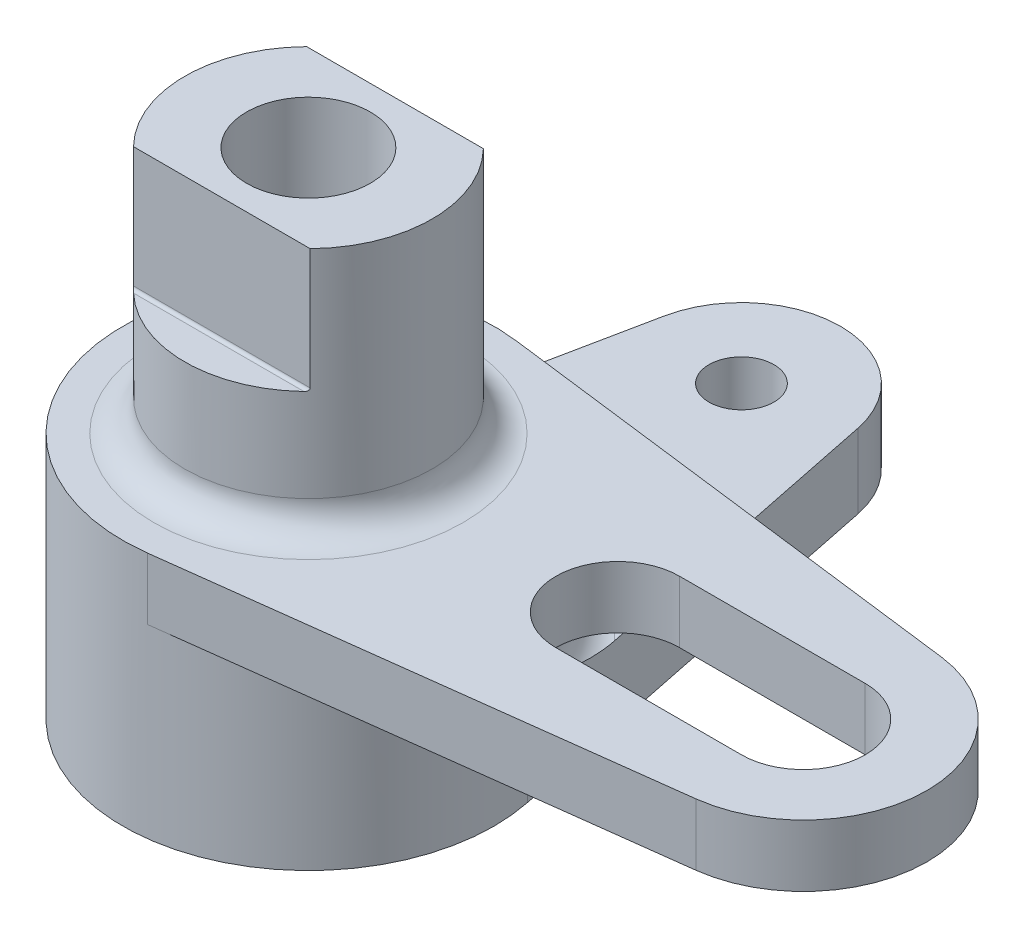
ISO-10303-21;
HEADER;
FILE_DESCRIPTION(('STEP AP214'),'2;1');
FILE_NAME('part.step','',(''),(''),'','','');
FILE_SCHEMA(('AUTOMOTIVE_DESIGN { 1 0 10303 214 1 1 1 1 }'));
ENDSEC;
DATA;
#1=APPLICATION_CONTEXT('core data for automotive mechanical design processes');
#2=APPLICATION_PROTOCOL_DEFINITION('international standard','automotive_design',2000,#1);
#3=PRODUCT_CONTEXT('',#1,'mechanical');
#4=PRODUCT('Part','Part','',(#3));
#5=PRODUCT_RELATED_PRODUCT_CATEGORY('part','',(#4));
#6=PRODUCT_DEFINITION_FORMATION('','',#4);
#7=PRODUCT_DEFINITION_CONTEXT('part definition',#1,'design');
#8=PRODUCT_DEFINITION('design','',#6,#7);
#9=PRODUCT_DEFINITION_SHAPE('','',#8);
#10=(LENGTH_UNIT() NAMED_UNIT(*) SI_UNIT(.MILLI.,.METRE.));
#11=(NAMED_UNIT(*) PLANE_ANGLE_UNIT() SI_UNIT($,.RADIAN.));
#12=(NAMED_UNIT(*) SI_UNIT($,.STERADIAN.) SOLID_ANGLE_UNIT());
#13=UNCERTAINTY_MEASURE_WITH_UNIT(LENGTH_MEASURE(1.E-05),#10,'distance_accuracy_value','');
#14=(GEOMETRIC_REPRESENTATION_CONTEXT(3) GLOBAL_UNCERTAINTY_ASSIGNED_CONTEXT((#13)) GLOBAL_UNIT_ASSIGNED_CONTEXT((#10,
#11,#12)) REPRESENTATION_CONTEXT('',''));
#15=CARTESIAN_POINT('',(0.,0.,0.));
#16=DIRECTION('',(0.,0.,1.));
#17=DIRECTION('',(1.,0.,0.));
#18=AXIS2_PLACEMENT_3D('',#15,#16,#17);
#19=CARTESIAN_POINT('',(0.,40.,0.));
#20=DIRECTION('',(0.,-1.,0.));
#21=DIRECTION('',(0.,0.,-1.));
#22=AXIS2_PLACEMENT_3D('',#19,#20,#21);
#23=CYLINDRICAL_SURFACE('',#22,30.);
#24=CARTESIAN_POINT('',(0.,17.,0.));
#25=DIRECTION('',(0.,1.,0.));
#26=DIRECTION('',(0.,0.,1.));
#27=AXIS2_PLACEMENT_3D('',#24,#25,#26);
#28=CIRCLE('',#27,30.);
#29=CARTESIAN_POINT('',(29.3938769133981,17.,-6.));
#30=VERTEX_POINT('',#29);
#31=CARTESIAN_POINT('',(-29.3938769133981,17.,-6.));
#32=VERTEX_POINT('',#31);
#33=EDGE_CURVE('E326',#30,#32,#28,.T.);
#34=ORIENTED_EDGE('',*,*,#33,.T.);
#35=DIRECTION('',(0.,-1.,0.));
#36=VECTOR('',#35,1.);
#37=CARTESIAN_POINT('',(-29.3938769133981,12.,-6.));
#38=LINE('',#37,#36);
#39=CARTESIAN_POINT('',(-29.3938769133981,0.,-6.));
#40=VERTEX_POINT('',#39);
#41=EDGE_CURVE('E276',#32,#40,#38,.T.);
#42=ORIENTED_EDGE('',*,*,#41,.T.);
#43=CARTESIAN_POINT('',(0.,0.,0.));
#44=DIRECTION('',(0.,1.,0.));
#45=DIRECTION('',(0.,0.,1.));
#46=AXIS2_PLACEMENT_3D('',#43,#44,#45);
#47=CIRCLE('',#46,30.);
#48=CARTESIAN_POINT('',(29.3938769133981,0.,-6.));
#49=VERTEX_POINT('',#48);
#50=EDGE_CURVE('E315',#40,#49,#47,.T.);
#51=ORIENTED_EDGE('',*,*,#50,.T.);
#52=DIRECTION('',(0.,-1.,0.));
#53=VECTOR('',#52,1.);
#54=CARTESIAN_POINT('',(29.3938769133981,12.,-6.));
#55=LINE('',#54,#53);
#56=EDGE_CURVE('E267',#30,#49,#55,.T.);
#57=ORIENTED_EDGE('',*,*,#56,.F.);
#58=EDGE_LOOP('',(#34,#42,#51,#57));
#59=FACE_BOUND('',#58,.T.);
#60=DIRECTION('',(0.,1.,0.));
#61=VECTOR('',#60,1.);
#62=CARTESIAN_POINT('',(3.75,30.,29.7647022494767));
#63=LINE('',#62,#61);
#64=CARTESIAN_POINT('',(3.75,30.,29.7647022494767));
#65=VERTEX_POINT('',#64);
#66=CARTESIAN_POINT('',(3.75,40.,29.7647022494767));
#67=VERTEX_POINT('',#66);
#68=EDGE_CURVE('E244',#65,#67,#63,.T.);
#69=ORIENTED_EDGE('',*,*,#68,.T.);
#70=CARTESIAN_POINT('',(0.,40.,0.));
#71=DIRECTION('',(0.,1.,0.));
#72=DIRECTION('',(0.,0.,1.));
#73=AXIS2_PLACEMENT_3D('',#70,#71,#72);
#74=CIRCLE('',#73,30.);
#75=CARTESIAN_POINT('',(3.75,40.,-29.7647022494766));
#76=VERTEX_POINT('',#75);
#77=EDGE_CURVE('E316',#76,#67,#74,.T.);
#78=ORIENTED_EDGE('',*,*,#77,.F.);
#79=DIRECTION('',(0.,1.,0.));
#80=VECTOR('',#79,1.);
#81=CARTESIAN_POINT('',(3.75,30.,-29.7647022494767));
#82=LINE('',#81,#80);
#83=CARTESIAN_POINT('',(3.75,30.,-29.7647022494767));
#84=VERTEX_POINT('',#83);
#85=EDGE_CURVE('E248',#84,#76,#82,.T.);
#86=ORIENTED_EDGE('',*,*,#85,.F.);
#87=CARTESIAN_POINT('',(0.,30.,0.));
#88=DIRECTION('',(0.,1.,0.));
#89=DIRECTION('',(0.,0.,1.));
#90=AXIS2_PLACEMENT_3D('',#87,#88,#89);
#91=CIRCLE('',#90,30.);
#92=EDGE_CURVE('E204',#65,#84,#91,.T.);
#93=ORIENTED_EDGE('',*,*,#92,.F.);
#94=EDGE_LOOP('',(#69,#78,#86,#93));
#95=FACE_BOUND('',#94,.T.);
#96=ADVANCED_FACE('F47',(#59,#95),#23,.T.);
#97=CARTESIAN_POINT('',(0.,40.,0.));
#98=DIRECTION('',(0.,1.,0.));
#99=DIRECTION('',(0.,0.,1.));
#100=AXIS2_PLACEMENT_3D('',#97,#98,#99);
#101=PLANE('',#100);
#102=CARTESIAN_POINT('',(0.,40.,0.));
#103=DIRECTION('',(0.,1.,0.));
#104=DIRECTION('',(0.,0.,1.));
#105=AXIS2_PLACEMENT_3D('',#102,#103,#104);
#106=CIRCLE('',#105,25.);
#107=CARTESIAN_POINT('',(0.,40.,25.));
#108=VERTEX_POINT('',#107);
#109=EDGE_CURVE('E323',#108,#108,#106,.F.);
#110=ORIENTED_EDGE('',*,*,#109,.T.);
#111=EDGE_LOOP('',(#110));
#112=FACE_BOUND('',#111,.T.);
#113=ORIENTED_EDGE('',*,*,#77,.T.);
#114=DIRECTION('',(0.992156741649222,0.,-0.125));
#115=VECTOR('',#114,1.);
#116=CARTESIAN_POINT('',(3.75,40.,29.7647022494766));
#117=LINE('',#116,#115);
#118=CARTESIAN_POINT('',(82.5,40.,19.8431348329844));
#119=VERTEX_POINT('',#118);
#120=EDGE_CURVE('E239',#67,#119,#117,.T.);
#121=ORIENTED_EDGE('',*,*,#120,.T.);
#122=CARTESIAN_POINT('',(80.,40.,0.));
#123=DIRECTION('',(0.,1.,0.));
#124=DIRECTION('',(0.,0.,1.));
#125=AXIS2_PLACEMENT_3D('',#122,#123,#124);
#126=CIRCLE('',#125,20.);
#127=CARTESIAN_POINT('',(82.5,40.,-19.8431348329844));
#128=VERTEX_POINT('',#127);
#129=EDGE_CURVE('E212',#119,#128,#126,.T.);
#130=ORIENTED_EDGE('',*,*,#129,.T.);
#131=DIRECTION('',(0.992156741649222,0.,0.125));
#132=VECTOR('',#131,1.);
#133=CARTESIAN_POINT('',(3.75,40.,-29.7647022494766));
#134=LINE('',#133,#132);
#135=EDGE_CURVE('E209',#76,#128,#134,.T.);
#136=ORIENTED_EDGE('',*,*,#135,.F.);
#137=EDGE_LOOP('',(#113,#121,#130,#136));
#138=FACE_BOUND('',#137,.T.);
#139=CARTESIAN_POINT('',(80.,40.,0.));
#140=DIRECTION('',(0.,1.,0.));
#141=DIRECTION('',(0.,0.,1.));
#142=AXIS2_PLACEMENT_3D('',#139,#140,#141);
#143=CIRCLE('',#142,10.);
#144=CARTESIAN_POINT('',(80.,40.,10.));
#145=VERTEX_POINT('',#144);
#146=CARTESIAN_POINT('',(80.,40.,-10.));
#147=VERTEX_POINT('',#146);
#148=EDGE_CURVE('E231',#145,#147,#143,.T.);
#149=ORIENTED_EDGE('',*,*,#148,.F.);
#150=DIRECTION('',(1.,0.,0.));
#151=VECTOR('',#150,1.);
#152=CARTESIAN_POINT('',(0.,40.,10.));
#153=LINE('',#152,#151);
#154=CARTESIAN_POINT('',(50.,40.,10.));
#155=VERTEX_POINT('',#154);
#156=EDGE_CURVE('E199',#155,#145,#153,.T.);
#157=ORIENTED_EDGE('',*,*,#156,.F.);
#158=CARTESIAN_POINT('',(50.,40.,0.));
#159=DIRECTION('',(0.,1.,0.));
#160=DIRECTION('',(0.,0.,1.));
#161=AXIS2_PLACEMENT_3D('',#158,#159,#160);
#162=CIRCLE('',#161,10.);
#163=CARTESIAN_POINT('',(50.,40.,-10.));
#164=VERTEX_POINT('',#163);
#165=EDGE_CURVE('E234',#164,#155,#162,.T.);
#166=ORIENTED_EDGE('',*,*,#165,.F.);
#167=DIRECTION('',(1.,0.,0.));
#168=VECTOR('',#167,1.);
#169=CARTESIAN_POINT('',(0.,40.,-10.));
#170=LINE('',#169,#168);
#171=EDGE_CURVE('E236',#164,#147,#170,.T.);
#172=ORIENTED_EDGE('',*,*,#171,.T.);
#173=EDGE_LOOP('',(#149,#157,#166,#172));
#174=FACE_BOUND('',#173,.T.);
#175=ADVANCED_FACE('F445',(#112,#138,#174),#101,.T.);
#176=CARTESIAN_POINT('',(0.,0.,0.));
#177=DIRECTION('',(0.,1.,0.));
#178=DIRECTION('',(0.,0.,1.));
#179=AXIS2_PLACEMENT_3D('',#176,#177,#178);
#180=PLANE('',#179);
#181=CARTESIAN_POINT('',(0.,0.,-70.));
#182=DIRECTION('',(0.,1.,0.));
#183=DIRECTION('',(0.,0.,1.));
#184=AXIS2_PLACEMENT_3D('',#181,#182,#183);
#185=CIRCLE('',#184,5.25);
#186=CARTESIAN_POINT('',(0.,0.,-64.75));
#187=VERTEX_POINT('',#186);
#188=EDGE_CURVE('E215',#187,#187,#185,.T.);
#189=ORIENTED_EDGE('',*,*,#188,.T.);
#190=EDGE_LOOP('',(#189));
#191=FACE_BOUND('',#190,.T.);
#192=ORIENTED_EDGE('',*,*,#50,.F.);
#193=DIRECTION('',(-0.2,0.,0.979795897113271));
#194=VECTOR('',#193,1.);
#195=CARTESIAN_POINT('',(-29.3938769133981,0.,-6.));
#196=LINE('',#195,#194);
#197=CARTESIAN_POINT('',(-15.6767343538123,0.,-73.2));
#198=VERTEX_POINT('',#197);
#199=EDGE_CURVE('E262',#198,#40,#196,.T.);
#200=ORIENTED_EDGE('',*,*,#199,.F.);
#201=CARTESIAN_POINT('',(0.,0.,-70.));
#202=DIRECTION('',(0.,1.,0.));
#203=DIRECTION('',(0.,0.,1.));
#204=AXIS2_PLACEMENT_3D('',#201,#202,#203);
#205=CIRCLE('',#204,16.);
#206=CARTESIAN_POINT('',(15.6767343538123,0.,-73.2));
#207=VERTEX_POINT('',#206);
#208=EDGE_CURVE('E270',#207,#198,#205,.T.);
#209=ORIENTED_EDGE('',*,*,#208,.F.);
#210=DIRECTION('',(0.2,0.,0.979795897113271));
#211=VECTOR('',#210,1.);
#212=CARTESIAN_POINT('',(29.3938769133981,0.,-6.00000000000001));
#213=LINE('',#212,#211);
#214=EDGE_CURVE('E247',#207,#49,#213,.T.);
#215=ORIENTED_EDGE('',*,*,#214,.T.);
#216=EDGE_LOOP('',(#192,#200,#209,#215));
#217=FACE_BOUND('',#216,.T.);
#218=CARTESIAN_POINT('',(0.,0.,0.));
#219=DIRECTION('',(0.,1.,0.));
#220=DIRECTION('',(0.,0.,1.));
#221=AXIS2_PLACEMENT_3D('',#218,#219,#220);
#222=CIRCLE('',#221,10.);
#223=CARTESIAN_POINT('',(0.,0.,10.));
#224=VERTEX_POINT('',#223);
#225=EDGE_CURVE('E289',#224,#224,#222,.T.);
#226=ORIENTED_EDGE('',*,*,#225,.T.);
#227=EDGE_LOOP('',(#226));
#228=FACE_BOUND('',#227,.T.);
#229=ADVANCED_FACE('F427',(#191,#217,#228),#180,.F.);
#230=CARTESIAN_POINT('',(0.,80.,14.));
#231=DIRECTION('',(0.,0.,-1.));
#232=DIRECTION('',(-1.,0.,0.));
#233=AXIS2_PLACEMENT_3D('',#230,#231,#232);
#234=PLANE('',#233);
#235=DIRECTION('',(0.,-1.,0.));
#236=VECTOR('',#235,1.);
#237=CARTESIAN_POINT('',(-14.2828568570857,80.,14.));
#238=LINE('',#237,#236);
#239=CARTESIAN_POINT('',(-14.2828568570857,80.,14.));
#240=VERTEX_POINT('',#239);
#241=CARTESIAN_POINT('',(-14.2828568570857,60.5,14.));
#242=VERTEX_POINT('',#241);
#243=EDGE_CURVE('E304',#240,#242,#238,.T.);
#244=ORIENTED_EDGE('',*,*,#243,.T.);
#245=DIRECTION('',(1.,0.,0.));
#246=VECTOR('',#245,1.);
#247=CARTESIAN_POINT('',(0.,60.5,14.));
#248=LINE('',#247,#246);
#249=CARTESIAN_POINT('',(14.2828568570857,60.5,14.));
#250=VERTEX_POINT('',#249);
#251=EDGE_CURVE('E407',#242,#250,#248,.T.);
#252=ORIENTED_EDGE('',*,*,#251,.T.);
#253=DIRECTION('',(0.,-1.,0.));
#254=VECTOR('',#253,1.);
#255=CARTESIAN_POINT('',(14.2828568570857,80.,14.));
#256=LINE('',#255,#254);
#257=CARTESIAN_POINT('',(14.2828568570857,80.,14.));
#258=VERTEX_POINT('',#257);
#259=EDGE_CURVE('E313',#258,#250,#256,.T.);
#260=ORIENTED_EDGE('',*,*,#259,.F.);
#261=DIRECTION('',(1.,0.,0.));
#262=VECTOR('',#261,1.);
#263=CARTESIAN_POINT('',(0.,80.,14.));
#264=LINE('',#263,#262);
#265=EDGE_CURVE('E293',#240,#258,#264,.T.);
#266=ORIENTED_EDGE('',*,*,#265,.F.);
#267=EDGE_LOOP('',(#244,#252,#260,#266));
#268=FACE_BOUND('',#267,.T.);
#269=ADVANCED_FACE('F381',(#268),#234,.F.);
#270=CARTESIAN_POINT('',(0.,80.,0.));
#271=DIRECTION('',(0.,-1.,0.));
#272=DIRECTION('',(0.,0.,-1.));
#273=AXIS2_PLACEMENT_3D('',#270,#271,#272);
#274=CYLINDRICAL_SURFACE('',#273,20.);
#275=CARTESIAN_POINT('',(0.,45.,0.));
#276=DIRECTION('',(0.,1.,0.));
#277=DIRECTION('',(0.,0.,1.));
#278=AXIS2_PLACEMENT_3D('',#275,#276,#277);
#279=CIRCLE('',#278,20.);
#280=CARTESIAN_POINT('',(0.,45.,20.));
#281=VERTEX_POINT('',#280);
#282=EDGE_CURVE('E319',#281,#281,#279,.T.);
#283=ORIENTED_EDGE('',*,*,#282,.T.);
#284=EDGE_LOOP('',(#283));
#285=FACE_BOUND('',#284,.T.);
#286=ORIENTED_EDGE('',*,*,#259,.T.);
#287=CARTESIAN_POINT('',(14.2828568570857,60.5,14.));
#288=CARTESIAN_POINT('',(14.282892211907,60.477494661395,13.9999622719365));
#289=CARTESIAN_POINT('',(14.2813701041783,60.4550427668654,14.0015168375368));
#290=CARTESIAN_POINT('',(14.2755173597065,60.4110817284993,14.0074848994275));
#291=CARTESIAN_POINT('',(14.2712100442842,60.3895663255434,14.0118746555228));
#292=CARTESIAN_POINT('',(14.2600985504329,60.3479735871636,14.0231825032615));
#293=CARTESIAN_POINT('',(14.2533007508946,60.3278927330725,14.0300941354273));
#294=CARTESIAN_POINT('',(14.2376040838453,60.28943237724,14.0460227920367));
#295=CARTESIAN_POINT('',(14.2287007265671,60.27105662959,14.0550443150259));
#296=CARTESIAN_POINT('',(14.2053738472395,60.229408634353,14.0786264465018));
#297=CARTESIAN_POINT('',(14.1901527945546,60.2070291832468,14.0939739336551));
#298=CARTESIAN_POINT('',(14.1573230076271,60.1660399055829,14.1269512045527));
#299=CARTESIAN_POINT('',(14.1397103225539,60.1474364463404,14.144584762517));
#300=CARTESIAN_POINT('',(14.0956199389038,60.107327308579,14.1885446525953));
#301=CARTESIAN_POINT('',(14.0683506116487,60.0874878196058,14.2155927794266));
#302=CARTESIAN_POINT('',(14.0117310277543,60.0541251796631,14.2714045210313));
#303=CARTESIAN_POINT('',(13.9823754305029,60.0406189648458,14.3001725062299));
#304=CARTESIAN_POINT('',(13.9235102048875,60.0198038427119,14.3574887665468));
#305=CARTESIAN_POINT('',(13.8940429847191,60.0122920816588,14.3860086315521));
#306=CARTESIAN_POINT('',(13.8347258889886,60.002424350045,14.4430630901981));
#307=CARTESIAN_POINT('',(13.8048810471959,60.0000271050636,14.4715956928404));
#308=CARTESIAN_POINT('',(13.7749773139559,60.,14.5));
#309=B_SPLINE_CURVE_WITH_KNOTS('',3,(#287,#288,#289,#290,#291,#292,#293,#294,#295,#296,#297,
#298,#299,#300,#301,#302,#303,#304,#305,#306,#307,#308),.UNSPECIFIED.,.F.,.F.,(4,2,2,2,2,2,2,2,
2,2,4),(0.,0.0673263470597117,0.134096126555385,0.200696070385866,0.267439329271865,
0.360265284093803,0.453246490738684,0.582236702285947,0.711569913643076,0.836314992419366,
0.960049503125349),.UNSPECIFIED.);
#310=CARTESIAN_POINT('',(13.7749773139559,60.,14.5));
#311=VERTEX_POINT('',#310);
#312=EDGE_CURVE('E61',#250,#311,#309,.T.);
#313=ORIENTED_EDGE('',*,*,#312,.T.);
#314=CARTESIAN_POINT('',(0.,60.,0.));
#315=DIRECTION('',(0.,1.,0.));
#316=DIRECTION('',(0.,0.,1.));
#317=AXIS2_PLACEMENT_3D('',#314,#315,#316);
#318=CIRCLE('',#317,20.);
#319=CARTESIAN_POINT('',(-13.7749773139559,60.,14.5));
#320=VERTEX_POINT('',#319);
#321=EDGE_CURVE('E284',#320,#311,#318,.T.);
#322=ORIENTED_EDGE('',*,*,#321,.F.);
#323=CARTESIAN_POINT('',(-13.7749773139559,60.,14.5));
#324=CARTESIAN_POINT('',(-13.7952407357506,60.0000080312996,14.4807499249937));
#325=CARTESIAN_POINT('',(-13.8154505218481,60.0011119909181,14.4614694931256));
#326=CARTESIAN_POINT('',(-13.855693649308,60.0055937352017,14.4229169512674));
#327=CARTESIAN_POINT('',(-13.8757266033549,60.0089756476998,14.40364492005));
#328=CARTESIAN_POINT('',(-13.9357093348323,60.022739395715,14.3456993827333));
#329=CARTESIAN_POINT('',(-13.9751673019818,60.0367424310823,14.3072534268503));
#330=CARTESIAN_POINT('',(-14.0380664338392,60.0687382527229,14.2454881069387));
#331=CARTESIAN_POINT('',(-14.0623796621282,60.08374044018,14.2214825901265));
#332=CARTESIAN_POINT('',(-14.1089653491334,60.1187085955669,14.1752658211089));
#333=CARTESIAN_POINT('',(-14.1312448589671,60.138656446586,14.1530484037623));
#334=CARTESIAN_POINT('',(-14.1678070688049,60.1784079523329,14.1164352821655));
#335=CARTESIAN_POINT('',(-14.1827211597233,60.1970814918784,14.1014468749487));
#336=CARTESIAN_POINT('',(-14.2102486595528,60.2375620145095,14.0737064492904));
#337=CARTESIAN_POINT('',(-14.2228641001514,60.2593661997564,14.060952456325));
#338=CARTESIAN_POINT('',(-14.2428393913386,60.3012871689917,14.0407153549967));
#339=CARTESIAN_POINT('',(-14.2507454096097,60.3208794910931,14.0326885038286));
#340=CARTESIAN_POINT('',(-14.2641660321524,60.3616411764,14.0190462998866));
#341=CARTESIAN_POINT('',(-14.269685688334,60.3828070957977,14.0134258530204));
#342=CARTESIAN_POINT('',(-14.2767926428851,60.420022411921,14.0061847266258));
#343=CARTESIAN_POINT('',(-14.2790519466013,60.435814180398,14.0038810216126));
#344=CARTESIAN_POINT('',(-14.2820907677102,60.4677313695244,14.000781570244));
#345=CARTESIAN_POINT('',(-14.2828658945224,60.4838576379134,13.9999902980697));
#346=CARTESIAN_POINT('',(-14.2828568570857,60.5,14.));
#347=B_SPLINE_CURVE_WITH_KNOTS('',3,(#323,#324,#325,#326,#327,#328,#329,#330,#331,#332,#333,
#334,#335,#336,#337,#338,#339,#340,#341,#342,#343,#344,#345,#346),.UNSPECIFIED.,.F.,.F.,(4,2,2,
2,2,2,2,2,2,2,2,4),(0.,0.0837874837691628,0.167727207089053,0.337143725549741,0.448766606793667,
0.559986482050822,0.644328774603917,0.728596154794627,0.796133110002654,0.863526381445509,
0.911745253995979,0.960106551431287),.UNSPECIFIED.);
#348=EDGE_CURVE('E11',#320,#242,#347,.T.);
#349=ORIENTED_EDGE('',*,*,#348,.T.);
#350=ORIENTED_EDGE('',*,*,#243,.F.);
#351=CARTESIAN_POINT('',(0.,80.,0.));
#352=DIRECTION('',(0.,1.,0.));
#353=DIRECTION('',(0.,0.,1.));
#354=AXIS2_PLACEMENT_3D('',#351,#352,#353);
#355=CIRCLE('',#354,20.);
#356=CARTESIAN_POINT('',(-14.2828568570857,80.,-14.));
#357=VERTEX_POINT('',#356);
#358=EDGE_CURVE('E299',#357,#240,#355,.T.);
#359=ORIENTED_EDGE('',*,*,#358,.F.);
#360=DIRECTION('',(0.,-1.,0.));
#361=VECTOR('',#360,1.);
#362=CARTESIAN_POINT('',(-14.2828568570857,80.,-14.));
#363=LINE('',#362,#361);
#364=CARTESIAN_POINT('',(-14.2828568570857,60.5,-14.));
#365=VERTEX_POINT('',#364);
#366=EDGE_CURVE('E307',#357,#365,#363,.T.);
#367=ORIENTED_EDGE('',*,*,#366,.T.);
#368=CARTESIAN_POINT('',(-14.2828568570857,60.5,-14.));
#369=CARTESIAN_POINT('',(-14.282892211907,60.477494661395,-13.9999622719365));
#370=CARTESIAN_POINT('',(-14.2813701041783,60.4550427668654,-14.0015168375368));
#371=CARTESIAN_POINT('',(-14.2755173597065,60.4110817284993,-14.0074848994275));
#372=CARTESIAN_POINT('',(-14.2712100442842,60.3895663255434,-14.0118746555228));
#373=CARTESIAN_POINT('',(-14.2600985504329,60.3479735871636,-14.0231825032615));
#374=CARTESIAN_POINT('',(-14.2533007508946,60.3278927330725,-14.0300941354273));
#375=CARTESIAN_POINT('',(-14.2376040838453,60.28943237724,-14.0460227920367));
#376=CARTESIAN_POINT('',(-14.2287007265671,60.27105662959,-14.0550443150259));
#377=CARTESIAN_POINT('',(-14.2053738472395,60.229408634353,-14.0786264465018));
#378=CARTESIAN_POINT('',(-14.1901527945546,60.2070291832468,-14.0939739336551));
#379=CARTESIAN_POINT('',(-14.1573230076271,60.1660399055829,-14.1269512045527));
#380=CARTESIAN_POINT('',(-14.1397103225539,60.1474364463404,-14.144584762517));
#381=CARTESIAN_POINT('',(-14.0956199389038,60.107327308579,-14.1885446525953));
#382=CARTESIAN_POINT('',(-14.0683506116487,60.0874878196058,-14.2155927794266));
#383=CARTESIAN_POINT('',(-14.0117310277543,60.0541251796631,-14.2714045210313));
#384=CARTESIAN_POINT('',(-13.9823754305029,60.0406189648458,-14.3001725062299));
#385=CARTESIAN_POINT('',(-13.9235102048875,60.0198038427119,-14.3574887665468));
#386=CARTESIAN_POINT('',(-13.8940429847191,60.0122920816588,-14.3860086315521));
#387=CARTESIAN_POINT('',(-13.8347258889886,60.002424350045,-14.4430630901981));
#388=CARTESIAN_POINT('',(-13.8048810471959,60.0000271050636,-14.4715956928404));
#389=CARTESIAN_POINT('',(-13.7749773139559,60.,-14.5));
#390=B_SPLINE_CURVE_WITH_KNOTS('',3,(#368,#369,#370,#371,#372,#373,#374,#375,#376,#377,#378,
#379,#380,#381,#382,#383,#384,#385,#386,#387,#388,#389),.UNSPECIFIED.,.F.,.F.,(4,2,2,2,2,2,2,2,
2,2,4),(0.,0.0673263470597117,0.134096126555385,0.200696070385866,0.267439329271865,
0.360265284093803,0.453246490738684,0.582236702285947,0.711569913643076,0.836314992419366,
0.960049503125349),.UNSPECIFIED.);
#391=CARTESIAN_POINT('',(-13.7749773139559,60.,-14.5));
#392=VERTEX_POINT('',#391);
#393=EDGE_CURVE('E395',#365,#392,#390,.T.);
#394=ORIENTED_EDGE('',*,*,#393,.T.);
#395=CARTESIAN_POINT('',(0.,60.,0.));
#396=DIRECTION('',(0.,1.,0.));
#397=DIRECTION('',(0.,0.,1.));
#398=AXIS2_PLACEMENT_3D('',#395,#396,#397);
#399=CIRCLE('',#398,20.);
#400=CARTESIAN_POINT('',(13.7749773139559,60.,-14.5));
#401=VERTEX_POINT('',#400);
#402=EDGE_CURVE('E286',#401,#392,#399,.T.);
#403=ORIENTED_EDGE('',*,*,#402,.F.);
#404=CARTESIAN_POINT('',(13.7749773139559,60.,-14.5));
#405=CARTESIAN_POINT('',(13.7952407357506,60.0000080312996,-14.4807499249937));
#406=CARTESIAN_POINT('',(13.8154505218481,60.0011119909181,-14.4614694931256));
#407=CARTESIAN_POINT('',(13.855693649308,60.0055937352017,-14.4229169512674));
#408=CARTESIAN_POINT('',(13.8757266033549,60.0089756476998,-14.40364492005));
#409=CARTESIAN_POINT('',(13.9357093348323,60.022739395715,-14.3456993827333));
#410=CARTESIAN_POINT('',(13.9751673019818,60.0367424310823,-14.3072534268503));
#411=CARTESIAN_POINT('',(14.0380664338392,60.0687382527229,-14.2454881069387));
#412=CARTESIAN_POINT('',(14.0623796621282,60.08374044018,-14.2214825901265));
#413=CARTESIAN_POINT('',(14.1089653491334,60.1187085955669,-14.1752658211089));
#414=CARTESIAN_POINT('',(14.1312448589671,60.138656446586,-14.1530484037623));
#415=CARTESIAN_POINT('',(14.1678070688049,60.1784079523329,-14.1164352821655));
#416=CARTESIAN_POINT('',(14.1827211597233,60.1970814918784,-14.1014468749487));
#417=CARTESIAN_POINT('',(14.2102486595528,60.2375620145095,-14.0737064492904));
#418=CARTESIAN_POINT('',(14.2228641001514,60.2593661997564,-14.060952456325));
#419=CARTESIAN_POINT('',(14.2428393913386,60.3012871689917,-14.0407153549967));
#420=CARTESIAN_POINT('',(14.2507454096097,60.3208794910931,-14.0326885038286));
#421=CARTESIAN_POINT('',(14.2641660321524,60.3616411764,-14.0190462998866));
#422=CARTESIAN_POINT('',(14.269685688334,60.3828070957977,-14.0134258530204));
#423=CARTESIAN_POINT('',(14.2767926428851,60.420022411921,-14.0061847266258));
#424=CARTESIAN_POINT('',(14.2790519466013,60.435814180398,-14.0038810216126));
#425=CARTESIAN_POINT('',(14.2820907677102,60.4677313695244,-14.000781570244));
#426=CARTESIAN_POINT('',(14.2828658945224,60.4838576379134,-13.9999902980697));
#427=CARTESIAN_POINT('',(14.2828568570857,60.5,-14.));
#428=B_SPLINE_CURVE_WITH_KNOTS('',3,(#404,#405,#406,#407,#408,#409,#410,#411,#412,#413,#414,
#415,#416,#417,#418,#419,#420,#421,#422,#423,#424,#425,#426,#427),.UNSPECIFIED.,.F.,.F.,(4,2,2,
2,2,2,2,2,2,2,2,4),(0.,0.0837874837691628,0.167727207089053,0.337143725549741,0.448766606793667,
0.559986482050822,0.644328774603917,0.728596154794627,0.796133110002654,0.863526381445509,
0.911745253995979,0.960106551431287),.UNSPECIFIED.);
#429=CARTESIAN_POINT('',(14.2828568570857,60.5,-14.));
#430=VERTEX_POINT('',#429);
#431=EDGE_CURVE('E387',#401,#430,#428,.T.);
#432=ORIENTED_EDGE('',*,*,#431,.T.);
#433=DIRECTION('',(0.,-1.,0.));
#434=VECTOR('',#433,1.);
#435=CARTESIAN_POINT('',(14.2828568570857,80.,-14.));
#436=LINE('',#435,#434);
#437=CARTESIAN_POINT('',(14.2828568570857,80.,-14.));
#438=VERTEX_POINT('',#437);
#439=EDGE_CURVE('E310',#438,#430,#436,.T.);
#440=ORIENTED_EDGE('',*,*,#439,.F.);
#441=EDGE_CURVE('E296',#258,#438,#355,.T.);
#442=ORIENTED_EDGE('',*,*,#441,.F.);
#443=EDGE_LOOP('',(#286,#313,#322,#349,#350,#359,#367,#394,#403,#432,#440,#442));
#444=FACE_BOUND('',#443,.T.);
#445=ADVANCED_FACE('F376',(#285,#444),#274,.T.);
#446=CARTESIAN_POINT('',(0.,80.,-14.));
#447=DIRECTION('',(0.,0.,-1.));
#448=DIRECTION('',(-1.,0.,0.));
#449=AXIS2_PLACEMENT_3D('',#446,#447,#448);
#450=PLANE('',#449);
#451=ORIENTED_EDGE('',*,*,#439,.T.);
#452=DIRECTION('',(1.,0.,0.));
#453=VECTOR('',#452,1.);
#454=CARTESIAN_POINT('',(-14.2828568570857,60.5,-14.));
#455=LINE('',#454,#453);
#456=EDGE_CURVE('E409',#430,#365,#455,.F.);
#457=ORIENTED_EDGE('',*,*,#456,.T.);
#458=ORIENTED_EDGE('',*,*,#366,.F.);
#459=DIRECTION('',(1.,0.,0.));
#460=VECTOR('',#459,1.);
#461=CARTESIAN_POINT('',(0.,80.,-14.));
#462=LINE('',#461,#460);
#463=EDGE_CURVE('E298',#357,#438,#462,.T.);
#464=ORIENTED_EDGE('',*,*,#463,.T.);
#465=EDGE_LOOP('',(#451,#457,#458,#464));
#466=FACE_BOUND('',#465,.T.);
#467=ADVANCED_FACE('F380',(#466),#450,.T.);
#468=CARTESIAN_POINT('',(0.,80.,0.));
#469=DIRECTION('',(0.,-1.,0.));
#470=DIRECTION('',(0.,0.,-1.));
#471=AXIS2_PLACEMENT_3D('',#468,#469,#470);
#472=CYLINDRICAL_SURFACE('',#471,10.);
#473=CARTESIAN_POINT('',(0.,80.,0.));
#474=DIRECTION('',(0.,1.,0.));
#475=DIRECTION('',(0.,0.,1.));
#476=AXIS2_PLACEMENT_3D('',#473,#474,#475);
#477=CIRCLE('',#476,10.);
#478=CARTESIAN_POINT('',(0.,80.,10.));
#479=VERTEX_POINT('',#478);
#480=EDGE_CURVE('E290',#479,#479,#477,.T.);
#481=ORIENTED_EDGE('',*,*,#480,.T.);
#482=EDGE_LOOP('',(#481));
#483=FACE_BOUND('',#482,.T.);
#484=ORIENTED_EDGE('',*,*,#225,.F.);
#485=EDGE_LOOP('',(#484));
#486=FACE_BOUND('',#485,.T.);
#487=ADVANCED_FACE('F374',(#483,#486),#472,.F.);
#488=CARTESIAN_POINT('',(0.,80.,0.));
#489=DIRECTION('',(0.,1.,0.));
#490=DIRECTION('',(0.,0.,1.));
#491=AXIS2_PLACEMENT_3D('',#488,#489,#490);
#492=PLANE('',#491);
#493=ORIENTED_EDGE('',*,*,#480,.F.);
#494=EDGE_LOOP('',(#493));
#495=FACE_BOUND('',#494,.T.);
#496=ORIENTED_EDGE('',*,*,#265,.T.);
#497=ORIENTED_EDGE('',*,*,#441,.T.);
#498=ORIENTED_EDGE('',*,*,#463,.F.);
#499=ORIENTED_EDGE('',*,*,#358,.T.);
#500=EDGE_LOOP('',(#496,#497,#498,#499));
#501=FACE_BOUND('',#500,.T.);
#502=ADVANCED_FACE('F371',(#495,#501),#492,.T.);
#503=CARTESIAN_POINT('',(0.,60.,0.));
#504=DIRECTION('',(0.,1.,0.));
#505=DIRECTION('',(0.,0.,1.));
#506=AXIS2_PLACEMENT_3D('',#503,#504,#505);
#507=PLANE('',#506);
#508=ORIENTED_EDGE('',*,*,#402,.T.);
#509=DIRECTION('',(1.,0.,0.));
#510=VECTOR('',#509,1.);
#511=CARTESIAN_POINT('',(14.2828568570857,60.,-14.5));
#512=LINE('',#511,#510);
#513=EDGE_CURVE('E412',#392,#401,#512,.T.);
#514=ORIENTED_EDGE('',*,*,#513,.T.);
#515=EDGE_LOOP('',(#508,#514));
#516=FACE_BOUND('',#515,.T.);
#517=ADVANCED_FACE('F368',(#516),#507,.T.);
#518=CARTESIAN_POINT('',(0.,60.,0.));
#519=DIRECTION('',(0.,1.,0.));
#520=DIRECTION('',(0.,0.,1.));
#521=AXIS2_PLACEMENT_3D('',#518,#519,#520);
#522=PLANE('',#521);
#523=ORIENTED_EDGE('',*,*,#321,.T.);
#524=DIRECTION('',(1.,0.,0.));
#525=VECTOR('',#524,1.);
#526=CARTESIAN_POINT('',(0.,60.,14.5));
#527=LINE('',#526,#525);
#528=EDGE_CURVE('E73',#311,#320,#527,.F.);
#529=ORIENTED_EDGE('',*,*,#528,.T.);
#530=EDGE_LOOP('',(#523,#529));
#531=FACE_BOUND('',#530,.T.);
#532=ADVANCED_FACE('F364',(#531),#522,.T.);
#533=CARTESIAN_POINT('',(29.3938769133981,12.,-6.00000000000001));
#534=DIRECTION('',(0.979795897113271,0.,-0.2));
#535=DIRECTION('',(-0.2,0.,-0.979795897113271));
#536=AXIS2_PLACEMENT_3D('',#533,#534,#535);
#537=PLANE('',#536);
#538=ORIENTED_EDGE('',*,*,#214,.F.);
#539=DIRECTION('',(0.,-1.,0.));
#540=VECTOR('',#539,1.);
#541=CARTESIAN_POINT('',(15.6767343538123,12.,-73.2));
#542=LINE('',#541,#540);
#543=CARTESIAN_POINT('',(15.6767343538123,12.,-73.2));
#544=VERTEX_POINT('',#543);
#545=EDGE_CURVE('E282',#544,#207,#542,.T.);
#546=ORIENTED_EDGE('',*,*,#545,.F.);
#547=DIRECTION('',(0.2,0.,0.979795897113271));
#548=VECTOR('',#547,1.);
#549=CARTESIAN_POINT('',(29.3938769133981,12.,-6.00000000000001));
#550=LINE('',#549,#548);
#551=CARTESIAN_POINT('',(25.7883256379342,12.,-23.6635217326557));
#552=VERTEX_POINT('',#551);
#553=EDGE_CURVE('E258',#544,#552,#550,.T.);
#554=ORIENTED_EDGE('',*,*,#553,.T.);
#555=CARTESIAN_POINT('',(25.7883256379342,12.,-23.6635217326557));
#556=CARTESIAN_POINT('',(25.8234102186404,12.0000035430437,-23.4916430915159));
#557=CARTESIAN_POINT('',(25.8584920369691,12.0024489062427,-23.3197779832076));
#558=CARTESIAN_POINT('',(25.9286275139112,12.0119359986988,-22.9761857204576));
#559=CARTESIAN_POINT('',(25.9636811750072,12.0189772645222,-22.8044585538543));
#560=CARTESIAN_POINT('',(26.0687327180951,12.046553358025,-22.2898131993398));
#561=CARTESIAN_POINT('',(26.1386651408333,12.0735412082803,-21.9472156949694));
#562=CARTESIAN_POINT('',(26.2780290537341,12.1426211194033,-21.2644747446399));
#563=CARTESIAN_POINT('',(26.347461391442,12.1846715902303,-20.9243271465743));
#564=CARTESIAN_POINT('',(26.4859554626848,12.2821715502576,-20.2458475326831));
#565=CARTESIAN_POINT('',(26.5550171335604,12.3376232362024,-19.9075158238243));
#566=CARTESIAN_POINT('',(26.7602219805335,12.5205535244561,-18.9022214881647));
#567=CARTESIAN_POINT('',(26.8957521464637,12.6653487134791,-18.2382619855971));
#568=CARTESIAN_POINT('',(27.1651064360042,12.9915020799322,-16.918700846789));
#569=CARTESIAN_POINT('',(27.2989291016327,13.1728895361376,-16.2631063531709));
#570=CARTESIAN_POINT('',(27.598484165158,13.6134272925837,-14.795592242163));
#571=CARTESIAN_POINT('',(27.7637377975022,13.8806465962757,-13.9860180873937));
#572=CARTESIAN_POINT('',(28.0921040577833,14.4463379463226,-12.3773585145241));
#573=CARTESIAN_POINT('',(28.2552160586663,14.7448189259327,-11.5782761683487));
#574=CARTESIAN_POINT('',(28.7429314786957,15.6712748673056,-9.18896833083045));
#575=CARTESIAN_POINT('',(29.0652271142359,16.3291464773686,-7.61004862403335));
#576=CARTESIAN_POINT('',(29.3896007352701,16.991271300645,-6.02094890892608));
#577=CARTESIAN_POINT('',(29.3917388252172,16.9956356585997,-6.01047445013678));
#578=CARTESIAN_POINT('',(29.3938769133981,17.,-6.00000000000001));
#579=B_SPLINE_CURVE_WITH_KNOTS('',3,(#555,#556,#557,#558,#559,#560,#561,#562,#563,#564,#565,
#566,#567,#568,#569,#570,#571,#572,#573,#574,#575,#576,#577,#578),.UNSPECIFIED.,.F.,.F.,(4,2,2,
2,2,2,2,2,2,2,2,4),(0.,0.526228685363312,1.05240431598424,2.10409662996596,3.1529071767188,
4.20188976259841,6.27927543794253,8.3583299436268,10.9625753529982,13.5675669857161,
18.7883727544024,18.8230137705546),.UNSPECIFIED.);
#580=EDGE_CURVE('E339',#552,#30,#579,.T.);
#581=ORIENTED_EDGE('',*,*,#580,.T.);
#582=ORIENTED_EDGE('',*,*,#56,.T.);
#583=EDGE_LOOP('',(#538,#546,#554,#581,#582));
#584=FACE_BOUND('',#583,.T.);
#585=ADVANCED_FACE('F359',(#584),#537,.T.);
#586=CARTESIAN_POINT('',(0.,12.,-70.));
#587=DIRECTION('',(0.,-1.,0.));
#588=DIRECTION('',(0.,0.,-1.));
#589=AXIS2_PLACEMENT_3D('',#586,#587,#588);
#590=CYLINDRICAL_SURFACE('',#589,16.);
#591=ORIENTED_EDGE('',*,*,#208,.T.);
#592=DIRECTION('',(0.,-1.,0.));
#593=VECTOR('',#592,1.);
#594=CARTESIAN_POINT('',(-15.6767343538123,12.,-73.2));
#595=LINE('',#594,#593);
#596=CARTESIAN_POINT('',(-15.6767343538123,12.,-73.2));
#597=VERTEX_POINT('',#596);
#598=EDGE_CURVE('E279',#597,#198,#595,.T.);
#599=ORIENTED_EDGE('',*,*,#598,.F.);
#600=CARTESIAN_POINT('',(0.,12.,-70.));
#601=DIRECTION('',(0.,1.,0.));
#602=DIRECTION('',(0.,0.,1.));
#603=AXIS2_PLACEMENT_3D('',#600,#601,#602);
#604=CIRCLE('',#603,16.);
#605=EDGE_CURVE('E261',#544,#597,#604,.T.);
#606=ORIENTED_EDGE('',*,*,#605,.F.);
#607=ORIENTED_EDGE('',*,*,#545,.T.);
#608=EDGE_LOOP('',(#591,#599,#606,#607));
#609=FACE_BOUND('',#608,.T.);
#610=ADVANCED_FACE('F355',(#609),#590,.T.);
#611=CARTESIAN_POINT('',(-29.3938769133981,12.,-6.));
#612=DIRECTION('',(0.979795897113271,0.,0.2));
#613=DIRECTION('',(0.2,0.,-0.979795897113271));
#614=AXIS2_PLACEMENT_3D('',#611,#612,#613);
#615=PLANE('',#614);
#616=ORIENTED_EDGE('',*,*,#199,.T.);
#617=ORIENTED_EDGE('',*,*,#41,.F.);
#618=CARTESIAN_POINT('',(-25.7883256379341,12.,-23.6635217326557));
#619=CARTESIAN_POINT('',(-25.823410218641,12.0000035430437,-23.4916430915132));
#620=CARTESIAN_POINT('',(-25.8584920369702,12.0024489062428,-23.3197779832022));
#621=CARTESIAN_POINT('',(-25.9286275139134,12.0119359986991,-22.9761857204468));
#622=CARTESIAN_POINT('',(-25.9636811750099,12.0189772645228,-22.8044585538408));
#623=CARTESIAN_POINT('',(-26.0687327180995,12.0465533580264,-22.2898131993182));
#624=CARTESIAN_POINT('',(-26.1386651408388,12.0735412082826,-21.9472156949425));
#625=CARTESIAN_POINT('',(-26.2780290537415,12.1426211194075,-21.2644747446035));
#626=CARTESIAN_POINT('',(-26.3474613914502,12.1846715902355,-20.9243271465338));
#627=CARTESIAN_POINT('',(-26.4859554626947,12.2821715502652,-20.2458475326343));
#628=CARTESIAN_POINT('',(-26.5550171335712,12.3376232362113,-19.9075158237715));
#629=CARTESIAN_POINT('',(-26.760221980543,12.5205535244661,-18.9022214881181));
#630=CARTESIAN_POINT('',(-26.8957521464711,12.665348713488,-18.2382619855608));
#631=CARTESIAN_POINT('',(-27.1651064360078,12.9915020799366,-16.9187008467713));
#632=CARTESIAN_POINT('',(-27.2989291016346,13.1728895361385,-16.2631063531616));
#633=CARTESIAN_POINT('',(-27.5984841651576,13.6134272925855,-14.7955922421649));
#634=CARTESIAN_POINT('',(-27.763737797501,13.8806465962836,-13.9860180873992));
#635=CARTESIAN_POINT('',(-28.0921040577829,14.4463379463121,-12.3773585145261));
#636=CARTESIAN_POINT('',(-28.2552160586673,14.7448189258974,-11.5782761683437));
#637=CARTESIAN_POINT('',(-28.7429314786889,15.6712748673677,-9.18896833086321));
#638=CARTESIAN_POINT('',(-29.0652271142056,16.3291464777225,-7.61004862417869));
#639=CARTESIAN_POINT('',(-29.3896007352697,16.9912713006497,-6.02094890892792));
#640=CARTESIAN_POINT('',(-29.391738825217,16.9956356586021,-6.0104744501377));
#641=CARTESIAN_POINT('',(-29.3938769133981,17.,-6.));
#642=B_SPLINE_CURVE_WITH_KNOTS('',3,(#618,#619,#620,#621,#622,#623,#624,#625,#626,#627,#628,
#629,#630,#631,#632,#633,#634,#635,#636,#637,#638,#639,#640,#641),.UNSPECIFIED.,.F.,.F.,(4,2,2,
2,2,2,2,2,2,2,2,4),(0.,0.526228685371621,1.05240431600087,2.10409662999899,3.15290717676475,
4.20188976265741,6.27927543797029,8.35832994362678,10.962575352995,13.5675669857049,
18.7883727544024,18.8230137705546),.UNSPECIFIED.);
#643=CARTESIAN_POINT('',(-25.7883256379341,12.,-23.6635217326557));
#644=VERTEX_POINT('',#643);
#645=EDGE_CURVE('E331',#32,#644,#642,.F.);
#646=ORIENTED_EDGE('',*,*,#645,.T.);
#647=DIRECTION('',(-0.2,0.,0.979795897113271));
#648=VECTOR('',#647,1.);
#649=CARTESIAN_POINT('',(-29.3938769133981,12.,-6.));
#650=LINE('',#649,#648);
#651=EDGE_CURVE('E264',#597,#644,#650,.T.);
#652=ORIENTED_EDGE('',*,*,#651,.F.);
#653=ORIENTED_EDGE('',*,*,#598,.T.);
#654=EDGE_LOOP('',(#616,#617,#646,#652,#653));
#655=FACE_BOUND('',#654,.T.);
#656=ADVANCED_FACE('F349',(#655),#615,.F.);
#657=CARTESIAN_POINT('',(0.,12.,0.));
#658=DIRECTION('',(0.,1.,0.));
#659=DIRECTION('',(0.,0.,1.));
#660=AXIS2_PLACEMENT_3D('',#657,#658,#659);
#661=PLANE('',#660);
#662=CARTESIAN_POINT('',(0.,12.,-70.));
#663=DIRECTION('',(0.,1.,0.));
#664=DIRECTION('',(0.,0.,1.));
#665=AXIS2_PLACEMENT_3D('',#662,#663,#664);
#666=CIRCLE('',#665,5.25);
#667=CARTESIAN_POINT('',(0.,12.,-64.75));
#668=VERTEX_POINT('',#667);
#669=EDGE_CURVE('E776',#668,#668,#666,.T.);
#670=ORIENTED_EDGE('',*,*,#669,.F.);
#671=EDGE_LOOP('',(#670));
#672=FACE_BOUND('',#671,.T.);
#673=ORIENTED_EDGE('',*,*,#651,.T.);
#674=CARTESIAN_POINT('',(0.,12.,0.));
#675=DIRECTION('',(0.,1.,0.));
#676=DIRECTION('',(0.,0.,1.));
#677=AXIS2_PLACEMENT_3D('',#674,#675,#676);
#678=CIRCLE('',#677,35.);
#679=EDGE_CURVE('E329',#644,#552,#678,.F.);
#680=ORIENTED_EDGE('',*,*,#679,.T.);
#681=ORIENTED_EDGE('',*,*,#553,.F.);
#682=ORIENTED_EDGE('',*,*,#605,.T.);
#683=EDGE_LOOP('',(#673,#680,#681,#682));
#684=FACE_BOUND('',#683,.T.);
#685=ADVANCED_FACE('F354',(#672,#684),#661,.T.);
#686=CARTESIAN_POINT('',(3.75,30.,29.7647022494766));
#687=DIRECTION('',(0.125,0.,0.992156741649222));
#688=DIRECTION('',(0.992156741649222,0.,-0.125));
#689=AXIS2_PLACEMENT_3D('',#686,#687,#688);
#690=PLANE('',#689);
#691=ORIENTED_EDGE('',*,*,#120,.F.);
#692=ORIENTED_EDGE('',*,*,#68,.F.);
#693=DIRECTION('',(0.992156741649222,0.,-0.125));
#694=VECTOR('',#693,1.);
#695=CARTESIAN_POINT('',(3.75,30.,29.7647022494766));
#696=LINE('',#695,#694);
#697=CARTESIAN_POINT('',(82.5,30.,19.8431348329844));
#698=VERTEX_POINT('',#697);
#699=EDGE_CURVE('E221',#65,#698,#696,.T.);
#700=ORIENTED_EDGE('',*,*,#699,.T.);
#701=DIRECTION('',(0.,1.,0.));
#702=VECTOR('',#701,1.);
#703=CARTESIAN_POINT('',(82.5,30.,19.8431348329844));
#704=LINE('',#703,#702);
#705=EDGE_CURVE('E252',#698,#119,#704,.T.);
#706=ORIENTED_EDGE('',*,*,#705,.T.);
#707=EDGE_LOOP('',(#691,#692,#700,#706));
#708=FACE_BOUND('',#707,.T.);
#709=ADVANCED_FACE('F435',(#708),#690,.T.);
#710=CARTESIAN_POINT('',(3.75,30.,-29.7647022494766));
#711=DIRECTION('',(-0.125,0.,0.992156741649222));
#712=DIRECTION('',(0.992156741649222,0.,0.125));
#713=AXIS2_PLACEMENT_3D('',#710,#711,#712);
#714=PLANE('',#713);
#715=ORIENTED_EDGE('',*,*,#135,.T.);
#716=DIRECTION('',(0.,1.,0.));
#717=VECTOR('',#716,1.);
#718=CARTESIAN_POINT('',(82.5,30.,-19.8431348329844));
#719=LINE('',#718,#717);
#720=CARTESIAN_POINT('',(82.5,30.,-19.8431348329844));
#721=VERTEX_POINT('',#720);
#722=EDGE_CURVE('E250',#721,#128,#719,.T.);
#723=ORIENTED_EDGE('',*,*,#722,.F.);
#724=DIRECTION('',(0.992156741649222,0.,0.125));
#725=VECTOR('',#724,1.);
#726=CARTESIAN_POINT('',(3.75,30.,-29.7647022494766));
#727=LINE('',#726,#725);
#728=EDGE_CURVE('E227',#84,#721,#727,.T.);
#729=ORIENTED_EDGE('',*,*,#728,.F.);
#730=ORIENTED_EDGE('',*,*,#85,.T.);
#731=EDGE_LOOP('',(#715,#723,#729,#730));
#732=FACE_BOUND('',#731,.T.);
#733=ADVANCED_FACE('F440',(#732),#714,.F.);
#734=CARTESIAN_POINT('',(80.,30.,0.));
#735=DIRECTION('',(0.,1.,0.));
#736=DIRECTION('',(0.,0.,1.));
#737=AXIS2_PLACEMENT_3D('',#734,#735,#736);
#738=CYLINDRICAL_SURFACE('',#737,10.);
#739=ORIENTED_EDGE('',*,*,#148,.T.);
#740=DIRECTION('',(0.,1.,0.));
#741=VECTOR('',#740,1.);
#742=CARTESIAN_POINT('',(80.,30.,-10.));
#743=LINE('',#742,#741);
#744=CARTESIAN_POINT('',(80.,30.,-10.));
#745=VERTEX_POINT('',#744);
#746=EDGE_CURVE('E207',#745,#147,#743,.T.);
#747=ORIENTED_EDGE('',*,*,#746,.F.);
#748=CARTESIAN_POINT('',(80.,30.,0.));
#749=DIRECTION('',(0.,1.,0.));
#750=DIRECTION('',(0.,0.,1.));
#751=AXIS2_PLACEMENT_3D('',#748,#749,#750);
#752=CIRCLE('',#751,10.);
#753=CARTESIAN_POINT('',(80.,30.,10.));
#754=VERTEX_POINT('',#753);
#755=EDGE_CURVE('E187',#754,#745,#752,.T.);
#756=ORIENTED_EDGE('',*,*,#755,.F.);
#757=DIRECTION('',(0.,1.,0.));
#758=VECTOR('',#757,1.);
#759=CARTESIAN_POINT('',(80.,30.,10.));
#760=LINE('',#759,#758);
#761=EDGE_CURVE('E196',#754,#145,#760,.T.);
#762=ORIENTED_EDGE('',*,*,#761,.T.);
#763=EDGE_LOOP('',(#739,#747,#756,#762));
#764=FACE_BOUND('',#763,.T.);
#765=ADVANCED_FACE('F206',(#764),#738,.F.);
#766=CARTESIAN_POINT('',(0.,30.,-10.));
#767=DIRECTION('',(0.,0.,1.));
#768=DIRECTION('',(1.,0.,0.));
#769=AXIS2_PLACEMENT_3D('',#766,#767,#768);
#770=PLANE('',#769);
#771=ORIENTED_EDGE('',*,*,#171,.F.);
#772=DIRECTION('',(0.,1.,0.));
#773=VECTOR('',#772,1.);
#774=CARTESIAN_POINT('',(50.,30.,-10.));
#775=LINE('',#774,#773);
#776=CARTESIAN_POINT('',(50.,30.,-10.));
#777=VERTEX_POINT('',#776);
#778=EDGE_CURVE('E255',#777,#164,#775,.T.);
#779=ORIENTED_EDGE('',*,*,#778,.F.);
#780=DIRECTION('',(1.,0.,0.));
#781=VECTOR('',#780,1.);
#782=CARTESIAN_POINT('',(0.,30.,-10.));
#783=LINE('',#782,#781);
#784=EDGE_CURVE('E219',#777,#745,#783,.T.);
#785=ORIENTED_EDGE('',*,*,#784,.T.);
#786=ORIENTED_EDGE('',*,*,#746,.T.);
#787=EDGE_LOOP('',(#771,#779,#785,#786));
#788=FACE_BOUND('',#787,.T.);
#789=ADVANCED_FACE('F637',(#788),#770,.T.);
#790=CARTESIAN_POINT('',(50.,30.,0.));
#791=DIRECTION('',(0.,1.,0.));
#792=DIRECTION('',(0.,0.,1.));
#793=AXIS2_PLACEMENT_3D('',#790,#791,#792);
#794=CYLINDRICAL_SURFACE('',#793,10.);
#795=ORIENTED_EDGE('',*,*,#165,.T.);
#796=DIRECTION('',(0.,1.,0.));
#797=VECTOR('',#796,1.);
#798=CARTESIAN_POINT('',(50.,30.,10.));
#799=LINE('',#798,#797);
#800=CARTESIAN_POINT('',(50.,30.,10.));
#801=VERTEX_POINT('',#800);
#802=EDGE_CURVE('E203',#801,#155,#799,.T.);
#803=ORIENTED_EDGE('',*,*,#802,.F.);
#804=CARTESIAN_POINT('',(50.,30.,0.));
#805=DIRECTION('',(0.,1.,0.));
#806=DIRECTION('',(0.,0.,1.));
#807=AXIS2_PLACEMENT_3D('',#804,#805,#806);
#808=CIRCLE('',#807,10.);
#809=EDGE_CURVE('E190',#777,#801,#808,.T.);
#810=ORIENTED_EDGE('',*,*,#809,.F.);
#811=ORIENTED_EDGE('',*,*,#778,.T.);
#812=EDGE_LOOP('',(#795,#803,#810,#811));
#813=FACE_BOUND('',#812,.T.);
#814=ADVANCED_FACE('F627',(#813),#794,.F.);
#815=CARTESIAN_POINT('',(0.,30.,10.));
#816=DIRECTION('',(0.,0.,1.));
#817=DIRECTION('',(1.,0.,0.));
#818=AXIS2_PLACEMENT_3D('',#815,#816,#817);
#819=PLANE('',#818);
#820=ORIENTED_EDGE('',*,*,#156,.T.);
#821=ORIENTED_EDGE('',*,*,#761,.F.);
#822=DIRECTION('',(1.,0.,0.));
#823=VECTOR('',#822,1.);
#824=CARTESIAN_POINT('',(0.,30.,10.));
#825=LINE('',#824,#823);
#826=EDGE_CURVE('E181',#801,#754,#825,.T.);
#827=ORIENTED_EDGE('',*,*,#826,.F.);
#828=ORIENTED_EDGE('',*,*,#802,.T.);
#829=EDGE_LOOP('',(#820,#821,#827,#828));
#830=FACE_BOUND('',#829,.T.);
#831=ADVANCED_FACE('F197',(#830),#819,.F.);
#832=CARTESIAN_POINT('',(80.,30.,0.));
#833=DIRECTION('',(0.,1.,0.));
#834=DIRECTION('',(0.,0.,1.));
#835=AXIS2_PLACEMENT_3D('',#832,#833,#834);
#836=CYLINDRICAL_SURFACE('',#835,20.);
#837=ORIENTED_EDGE('',*,*,#129,.F.);
#838=ORIENTED_EDGE('',*,*,#705,.F.);
#839=CARTESIAN_POINT('',(80.,30.,0.));
#840=DIRECTION('',(0.,1.,0.));
#841=DIRECTION('',(0.,0.,1.));
#842=AXIS2_PLACEMENT_3D('',#839,#840,#841);
#843=CIRCLE('',#842,20.);
#844=EDGE_CURVE('E224',#698,#721,#843,.T.);
#845=ORIENTED_EDGE('',*,*,#844,.T.);
#846=ORIENTED_EDGE('',*,*,#722,.T.);
#847=EDGE_LOOP('',(#837,#838,#845,#846));
#848=FACE_BOUND('',#847,.T.);
#849=ADVANCED_FACE('F607',(#848),#836,.T.);
#850=CARTESIAN_POINT('',(0.,30.,0.));
#851=DIRECTION('',(0.,1.,0.));
#852=DIRECTION('',(0.,0.,1.));
#853=AXIS2_PLACEMENT_3D('',#850,#851,#852);
#854=PLANE('',#853);
#855=ORIENTED_EDGE('',*,*,#755,.T.);
#856=ORIENTED_EDGE('',*,*,#784,.F.);
#857=ORIENTED_EDGE('',*,*,#809,.T.);
#858=ORIENTED_EDGE('',*,*,#826,.T.);
#859=EDGE_LOOP('',(#855,#856,#857,#858));
#860=FACE_BOUND('',#859,.T.);
#861=ORIENTED_EDGE('',*,*,#699,.F.);
#862=ORIENTED_EDGE('',*,*,#92,.T.);
#863=ORIENTED_EDGE('',*,*,#728,.T.);
#864=ORIENTED_EDGE('',*,*,#844,.F.);
#865=EDGE_LOOP('',(#861,#862,#863,#864));
#866=FACE_BOUND('',#865,.T.);
#867=ADVANCED_FACE('F183',(#860,#866),#854,.F.);
#868=CARTESIAN_POINT('',(0.,12.,-70.));
#869=DIRECTION('',(0.,1.,0.));
#870=DIRECTION('',(0.,0.,1.));
#871=AXIS2_PLACEMENT_3D('',#868,#869,#870);
#872=CYLINDRICAL_SURFACE('',#871,5.25);
#873=ORIENTED_EDGE('',*,*,#188,.F.);
#874=EDGE_LOOP('',(#873));
#875=FACE_BOUND('',#874,.T.);
#876=ORIENTED_EDGE('',*,*,#669,.T.);
#877=EDGE_LOOP('',(#876));
#878=FACE_BOUND('',#877,.T.);
#879=ADVANCED_FACE('F455',(#875,#878),#872,.F.);
#880=CARTESIAN_POINT('',(0.,45.,0.));
#881=DIRECTION('',(0.,1.,0.));
#882=DIRECTION('',(0.,0.,1.));
#883=AXIS2_PLACEMENT_3D('',#880,#881,#882);
#884=TOROIDAL_SURFACE('',#883,25.,5.);
#885=ORIENTED_EDGE('',*,*,#109,.F.);
#886=EDGE_LOOP('',(#885));
#887=FACE_BOUND('',#886,.T.);
#888=ORIENTED_EDGE('',*,*,#282,.F.);
#889=EDGE_LOOP('',(#888));
#890=FACE_BOUND('',#889,.T.);
#891=ADVANCED_FACE('F453',(#887,#890),#884,.F.);
#892=CARTESIAN_POINT('',(0.,17.,0.));
#893=DIRECTION('',(0.,1.,0.));
#894=DIRECTION('',(0.,0.,1.));
#895=AXIS2_PLACEMENT_3D('',#892,#893,#894);
#896=TOROIDAL_SURFACE('',#895,35.,5.);
#897=ORIENTED_EDGE('',*,*,#580,.F.);
#898=ORIENTED_EDGE('',*,*,#679,.F.);
#899=ORIENTED_EDGE('',*,*,#645,.F.);
#900=ORIENTED_EDGE('',*,*,#33,.F.);
#901=EDGE_LOOP('',(#897,#898,#899,#900));
#902=FACE_BOUND('',#901,.T.);
#903=ADVANCED_FACE('F346',(#902),#896,.F.);
#904=CARTESIAN_POINT('',(0.,60.5,-14.5));
#905=DIRECTION('',(-1.,0.,0.));
#906=DIRECTION('',(0.,0.,1.));
#907=AXIS2_PLACEMENT_3D('',#904,#905,#906);
#908=CYLINDRICAL_SURFACE('',#907,0.5);
#909=ORIENTED_EDGE('',*,*,#393,.F.);
#910=ORIENTED_EDGE('',*,*,#456,.F.);
#911=ORIENTED_EDGE('',*,*,#431,.F.);
#912=ORIENTED_EDGE('',*,*,#513,.F.);
#913=EDGE_LOOP('',(#909,#910,#911,#912));
#914=FACE_BOUND('',#913,.T.);
#915=ADVANCED_FACE('F461',(#914),#908,.F.);
#916=CARTESIAN_POINT('',(0.,60.5,14.5));
#917=DIRECTION('',(1.,0.,0.));
#918=DIRECTION('',(0.,0.,-1.));
#919=AXIS2_PLACEMENT_3D('',#916,#917,#918);
#920=CYLINDRICAL_SURFACE('',#919,0.5);
#921=ORIENTED_EDGE('',*,*,#348,.F.);
#922=ORIENTED_EDGE('',*,*,#528,.F.);
#923=ORIENTED_EDGE('',*,*,#312,.F.);
#924=ORIENTED_EDGE('',*,*,#251,.F.);
#925=EDGE_LOOP('',(#921,#922,#923,#924));
#926=FACE_BOUND('',#925,.T.);
#927=ADVANCED_FACE('F49',(#926),#920,.F.);
#928=CLOSED_SHELL('',(#96,#175,#229,#269,#445,#467,#487,#502,#517,#532,#585,#610,#656,#685,#709,
#733,#765,#789,#814,#831,#849,#867,#879,#891,#903,#915,#927));
#929=MANIFOLD_SOLID_BREP('B2',#928);
#930=ADVANCED_BREP_SHAPE_REPRESENTATION('',(#18,#929),#14);
#931=SHAPE_DEFINITION_REPRESENTATION(#9,#930);
ENDSEC;
END-ISO-10303-21;
